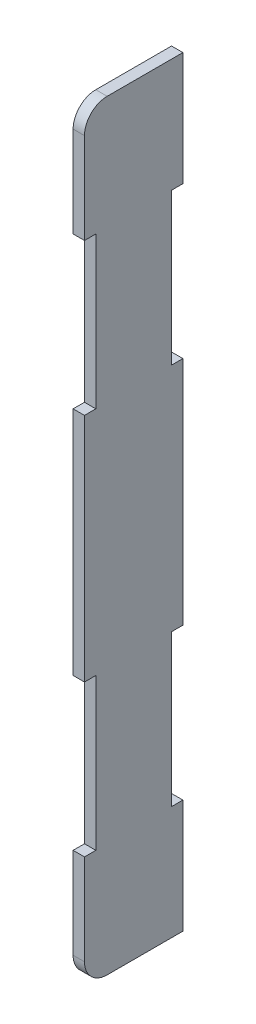
ISO-10303-21;
HEADER;
FILE_DESCRIPTION(('STEP AP214'),'2;1');
FILE_NAME('part.step','',(''),(''),'','','');
FILE_SCHEMA(('AUTOMOTIVE_DESIGN { 1 0 10303 214 1 1 1 1 }'));
ENDSEC;
DATA;
#1=APPLICATION_CONTEXT('core data for automotive mechanical design processes');
#2=APPLICATION_PROTOCOL_DEFINITION('international standard','automotive_design',2000,#1);
#3=PRODUCT_CONTEXT('',#1,'mechanical');
#4=PRODUCT('Part','Part','',(#3));
#5=PRODUCT_RELATED_PRODUCT_CATEGORY('part','',(#4));
#6=PRODUCT_DEFINITION_FORMATION('','',#4);
#7=PRODUCT_DEFINITION_CONTEXT('part definition',#1,'design');
#8=PRODUCT_DEFINITION('design','',#6,#7);
#9=PRODUCT_DEFINITION_SHAPE('','',#8);
#10=(LENGTH_UNIT() NAMED_UNIT(*) SI_UNIT(.MILLI.,.METRE.));
#11=(NAMED_UNIT(*) PLANE_ANGLE_UNIT() SI_UNIT($,.RADIAN.));
#12=(NAMED_UNIT(*) SI_UNIT($,.STERADIAN.) SOLID_ANGLE_UNIT());
#13=UNCERTAINTY_MEASURE_WITH_UNIT(LENGTH_MEASURE(1.E-05),#10,'distance_accuracy_value','');
#14=(GEOMETRIC_REPRESENTATION_CONTEXT(3) GLOBAL_UNCERTAINTY_ASSIGNED_CONTEXT((#13)) GLOBAL_UNIT_ASSIGNED_CONTEXT((#10,
#11,#12)) REPRESENTATION_CONTEXT('',''));
#15=CARTESIAN_POINT('',(0.,0.,0.));
#16=DIRECTION('',(0.,0.,1.));
#17=DIRECTION('',(1.,0.,0.));
#18=AXIS2_PLACEMENT_3D('',#15,#16,#17);
#19=CARTESIAN_POINT('',(3.,82.3989535577918,-5.56739419551117));
#20=DIRECTION('',(0.,0.,1.));
#21=DIRECTION('',(0.,-1.,0.));
#22=AXIS2_PLACEMENT_3D('',#19,#20,#21);
#23=PLANE('',#22);
#24=DIRECTION('',(-1.,0.,0.));
#25=VECTOR('',#24,1.);
#26=CARTESIAN_POINT('',(3.,12.3989535577918,-5.5673941955112));
#27=LINE('',#26,#25);
#28=CARTESIAN_POINT('',(3.,12.3989535577918,-5.5673941955112));
#29=VERTEX_POINT('',#28);
#30=CARTESIAN_POINT('',(0.,12.3989535577918,-5.5673941955112));
#31=VERTEX_POINT('',#30);
#32=EDGE_CURVE('E1307',#29,#31,#27,.T.);
#33=ORIENTED_EDGE('',*,*,#32,.F.);
#34=DIRECTION('',(0.,1.,0.));
#35=VECTOR('',#34,1.);
#36=CARTESIAN_POINT('',(3.,82.3989535577918,-5.56739419551117));
#37=LINE('',#36,#35);
#38=CARTESIAN_POINT('',(3.,-48.6010464422083,-5.5673941955112));
#39=VERTEX_POINT('',#38);
#40=EDGE_CURVE('E1347',#39,#29,#37,.T.);
#41=ORIENTED_EDGE('',*,*,#40,.F.);
#42=DIRECTION('',(-1.,0.,0.));
#43=VECTOR('',#42,1.);
#44=CARTESIAN_POINT('',(3.,-48.6010464422083,-5.5673941955112));
#45=LINE('',#44,#43);
#46=CARTESIAN_POINT('',(0.,-48.6010464422083,-5.5673941955112));
#47=VERTEX_POINT('',#46);
#48=EDGE_CURVE('E1328',#39,#47,#45,.T.);
#49=ORIENTED_EDGE('',*,*,#48,.T.);
#50=DIRECTION('',(0.,1.,0.));
#51=VECTOR('',#50,1.);
#52=CARTESIAN_POINT('',(0.,82.3989535577918,-5.56739419551117));
#53=LINE('',#52,#51);
#54=EDGE_CURVE('E1360',#47,#31,#53,.T.);
#55=ORIENTED_EDGE('',*,*,#54,.T.);
#56=EDGE_LOOP('',(#33,#41,#49,#55));
#57=FACE_BOUND('',#56,.T.);
#58=ADVANCED_FACE('F1068',(#57),#23,.F.);
#59=DIRECTION('',(-1.,0.,0.));
#60=VECTOR('',#59,1.);
#61=CARTESIAN_POINT('',(3.,52.3989535577918,-5.5673941955112));
#62=LINE('',#61,#60);
#63=CARTESIAN_POINT('',(3.,52.3989535577918,-5.5673941955112));
#64=VERTEX_POINT('',#63);
#65=CARTESIAN_POINT('',(0.,52.3989535577918,-5.5673941955112));
#66=VERTEX_POINT('',#65);
#67=EDGE_CURVE('E1304',#64,#66,#62,.T.);
#68=ORIENTED_EDGE('',*,*,#67,.T.);
#69=CARTESIAN_POINT('',(0.,82.3989535577918,-5.56739419551117));
#70=VERTEX_POINT('',#69);
#71=EDGE_CURVE('E1355',#66,#70,#53,.T.);
#72=ORIENTED_EDGE('',*,*,#71,.T.);
#73=DIRECTION('',(-1.,0.,0.));
#74=VECTOR('',#73,1.);
#75=CARTESIAN_POINT('',(3.,82.3989535577918,-5.56739419551117));
#76=LINE('',#75,#74);
#77=CARTESIAN_POINT('',(3.,82.3989535577918,-5.56739419551117));
#78=VERTEX_POINT('',#77);
#79=EDGE_CURVE('E1349',#78,#70,#76,.T.);
#80=ORIENTED_EDGE('',*,*,#79,.F.);
#81=EDGE_CURVE('E1342',#64,#78,#37,.T.);
#82=ORIENTED_EDGE('',*,*,#81,.F.);
#83=EDGE_LOOP('',(#68,#72,#80,#82));
#84=FACE_BOUND('',#83,.T.);
#85=ADVANCED_FACE('F1404',(#84),#23,.F.);
#86=CARTESIAN_POINT('',(3.,0.,0.));
#87=DIRECTION('',(1.,0.,0.));
#88=DIRECTION('',(0.,0.,-1.));
#89=AXIS2_PLACEMENT_3D('',#86,#87,#88);
#90=PLANE('',#89);
#91=DIRECTION('',(0.,0.,1.));
#92=VECTOR('',#91,1.);
#93=CARTESIAN_POINT('',(3.,82.3989535577918,20.4326058044888));
#94=LINE('',#93,#92);
#95=CARTESIAN_POINT('',(3.,82.3989535577918,14.4326058044888));
#96=VERTEX_POINT('',#95);
#97=EDGE_CURVE('E1346',#78,#96,#94,.T.);
#98=ORIENTED_EDGE('',*,*,#97,.T.);
#99=CARTESIAN_POINT('',(3.,76.3989535577917,14.4326058044888));
#100=DIRECTION('',(1.,0.,0.));
#101=DIRECTION('',(0.,0.,-1.));
#102=AXIS2_PLACEMENT_3D('',#99,#100,#101);
#103=CIRCLE('',#102,6.);
#104=CARTESIAN_POINT('',(3.,76.3989535577917,20.4326058044888));
#105=VERTEX_POINT('',#104);
#106=EDGE_CURVE('E12',#96,#105,#103,.T.);
#107=ORIENTED_EDGE('',*,*,#106,.T.);
#108=DIRECTION('',(0.,-1.,0.));
#109=VECTOR('',#108,1.);
#110=CARTESIAN_POINT('',(3.,82.3989535577918,20.4326058044888));
#111=LINE('',#110,#109);
#112=CARTESIAN_POINT('',(3.,52.3989535577918,20.4326058044888));
#113=VERTEX_POINT('',#112);
#114=EDGE_CURVE('E1337',#105,#113,#111,.T.);
#115=ORIENTED_EDGE('',*,*,#114,.T.);
#116=DIRECTION('',(0.,0.,1.));
#117=VECTOR('',#116,1.);
#118=CARTESIAN_POINT('',(3.,52.3989535577918,17.4326058044888));
#119=LINE('',#118,#117);
#120=CARTESIAN_POINT('',(3.,52.3989535577918,17.4326058044888));
#121=VERTEX_POINT('',#120);
#122=EDGE_CURVE('E1261',#121,#113,#119,.T.);
#123=ORIENTED_EDGE('',*,*,#122,.F.);
#124=DIRECTION('',(0.,1.,0.));
#125=VECTOR('',#124,1.);
#126=CARTESIAN_POINT('',(3.,52.3989535577918,17.4326058044888));
#127=LINE('',#126,#125);
#128=CARTESIAN_POINT('',(3.,12.3989535577918,17.4326058044888));
#129=VERTEX_POINT('',#128);
#130=EDGE_CURVE('E1259',#129,#121,#127,.T.);
#131=ORIENTED_EDGE('',*,*,#130,.F.);
#132=DIRECTION('',(0.,0.,-1.));
#133=VECTOR('',#132,1.);
#134=CARTESIAN_POINT('',(3.,12.3989535577918,17.4326058044888));
#135=LINE('',#134,#133);
#136=CARTESIAN_POINT('',(3.,12.3989535577918,20.4326058044888));
#137=VERTEX_POINT('',#136);
#138=EDGE_CURVE('E1265',#137,#129,#135,.T.);
#139=ORIENTED_EDGE('',*,*,#138,.F.);
#140=CARTESIAN_POINT('',(3.,-48.6010464422083,20.4326058044888));
#141=VERTEX_POINT('',#140);
#142=EDGE_CURVE('E1243',#137,#141,#111,.T.);
#143=ORIENTED_EDGE('',*,*,#142,.T.);
#144=DIRECTION('',(0.,0.,1.));
#145=VECTOR('',#144,1.);
#146=CARTESIAN_POINT('',(3.,-48.6010464422083,17.4326058044888));
#147=LINE('',#146,#145);
#148=CARTESIAN_POINT('',(3.,-48.6010464422083,17.4326058044888));
#149=VERTEX_POINT('',#148);
#150=EDGE_CURVE('E1228',#149,#141,#147,.T.);
#151=ORIENTED_EDGE('',*,*,#150,.F.);
#152=DIRECTION('',(0.,1.,0.));
#153=VECTOR('',#152,1.);
#154=CARTESIAN_POINT('',(3.,-88.6010464422083,17.4326058044888));
#155=LINE('',#154,#153);
#156=CARTESIAN_POINT('',(3.,-88.6010464422083,17.4326058044888));
#157=VERTEX_POINT('',#156);
#158=EDGE_CURVE('E1218',#157,#149,#155,.T.);
#159=ORIENTED_EDGE('',*,*,#158,.F.);
#160=DIRECTION('',(0.,0.,-1.));
#161=VECTOR('',#160,1.);
#162=CARTESIAN_POINT('',(3.,-88.6010464422083,17.4326058044888));
#163=LINE('',#162,#161);
#164=CARTESIAN_POINT('',(3.,-88.6010464422083,20.4326058044888));
#165=VERTEX_POINT('',#164);
#166=EDGE_CURVE('E1244',#165,#157,#163,.T.);
#167=ORIENTED_EDGE('',*,*,#166,.F.);
#168=CARTESIAN_POINT('',(3.,-112.601046442208,20.4326058044888));
#169=VERTEX_POINT('',#168);
#170=EDGE_CURVE('E1340',#165,#169,#111,.T.);
#171=ORIENTED_EDGE('',*,*,#170,.T.);
#172=CARTESIAN_POINT('',(3.,-112.601046442208,14.4326058044888));
#173=DIRECTION('',(1.,0.,0.));
#174=DIRECTION('',(0.,0.,-1.));
#175=AXIS2_PLACEMENT_3D('',#172,#173,#174);
#176=CIRCLE('',#175,6.);
#177=CARTESIAN_POINT('',(3.,-118.601046442208,14.4326058044888));
#178=VERTEX_POINT('',#177);
#179=EDGE_CURVE('E1374',#169,#178,#176,.T.);
#180=ORIENTED_EDGE('',*,*,#179,.T.);
#181=DIRECTION('',(0.,0.,-1.));
#182=VECTOR('',#181,1.);
#183=CARTESIAN_POINT('',(3.,-118.601046442208,20.4326058044888));
#184=LINE('',#183,#182);
#185=CARTESIAN_POINT('',(3.,-118.601046442208,-5.5673941955112));
#186=VERTEX_POINT('',#185);
#187=EDGE_CURVE('E1339',#178,#186,#184,.T.);
#188=ORIENTED_EDGE('',*,*,#187,.T.);
#189=CARTESIAN_POINT('',(3.,-88.6010464422083,-5.5673941955112));
#190=VERTEX_POINT('',#189);
#191=EDGE_CURVE('E1343',#186,#190,#37,.T.);
#192=ORIENTED_EDGE('',*,*,#191,.T.);
#193=DIRECTION('',(0.,0.,-1.));
#194=VECTOR('',#193,1.);
#195=CARTESIAN_POINT('',(3.,-88.6010464422083,-2.5673941955112));
#196=LINE('',#195,#194);
#197=CARTESIAN_POINT('',(3.,-88.6010464422083,-2.5673941955112));
#198=VERTEX_POINT('',#197);
#199=EDGE_CURVE('E1313',#198,#190,#196,.T.);
#200=ORIENTED_EDGE('',*,*,#199,.F.);
#201=DIRECTION('',(0.,-1.,0.));
#202=VECTOR('',#201,1.);
#203=CARTESIAN_POINT('',(3.,-88.6010464422083,-2.5673941955112));
#204=LINE('',#203,#202);
#205=CARTESIAN_POINT('',(3.,-48.6010464422083,-2.5673941955112));
#206=VERTEX_POINT('',#205);
#207=EDGE_CURVE('E1311',#206,#198,#204,.T.);
#208=ORIENTED_EDGE('',*,*,#207,.F.);
#209=DIRECTION('',(0.,0.,1.));
#210=VECTOR('',#209,1.);
#211=CARTESIAN_POINT('',(3.,-48.6010464422083,-2.5673941955112));
#212=LINE('',#211,#210);
#213=EDGE_CURVE('E1316',#39,#206,#212,.T.);
#214=ORIENTED_EDGE('',*,*,#213,.F.);
#215=ORIENTED_EDGE('',*,*,#40,.T.);
#216=DIRECTION('',(0.,0.,-1.));
#217=VECTOR('',#216,1.);
#218=CARTESIAN_POINT('',(3.,12.3989535577918,-2.5673941955112));
#219=LINE('',#218,#217);
#220=CARTESIAN_POINT('',(3.,12.3989535577918,-2.5673941955112));
#221=VERTEX_POINT('',#220);
#222=EDGE_CURVE('E1288',#221,#29,#219,.T.);
#223=ORIENTED_EDGE('',*,*,#222,.F.);
#224=DIRECTION('',(0.,-1.,0.));
#225=VECTOR('',#224,1.);
#226=CARTESIAN_POINT('',(3.,52.3989535577918,-2.5673941955112));
#227=LINE('',#226,#225);
#228=CARTESIAN_POINT('',(3.,52.3989535577918,-2.5673941955112));
#229=VERTEX_POINT('',#228);
#230=EDGE_CURVE('E1286',#229,#221,#227,.T.);
#231=ORIENTED_EDGE('',*,*,#230,.F.);
#232=DIRECTION('',(0.,0.,1.));
#233=VECTOR('',#232,1.);
#234=CARTESIAN_POINT('',(3.,52.3989535577918,-2.5673941955112));
#235=LINE('',#234,#233);
#236=EDGE_CURVE('E1291',#64,#229,#235,.T.);
#237=ORIENTED_EDGE('',*,*,#236,.F.);
#238=ORIENTED_EDGE('',*,*,#81,.T.);
#239=EDGE_LOOP('',(#98,#107,#115,#123,#131,#139,#143,#151,#159,#167,#171,#180,#188,#192,#200,
#208,#214,#215,#223,#231,#237,#238));
#240=FACE_BOUND('',#239,.T.);
#241=ADVANCED_FACE('F1240',(#240),#90,.T.);
#242=CARTESIAN_POINT('',(0.,0.,0.));
#243=DIRECTION('',(1.,0.,0.));
#244=DIRECTION('',(0.,0.,-1.));
#245=AXIS2_PLACEMENT_3D('',#242,#243,#244);
#246=PLANE('',#245);
#247=DIRECTION('',(0.,-1.,0.));
#248=VECTOR('',#247,1.);
#249=CARTESIAN_POINT('',(0.,82.3989535577918,20.4326058044888));
#250=LINE('',#249,#248);
#251=CARTESIAN_POINT('',(0.,76.3989535577917,20.4326058044888));
#252=VERTEX_POINT('',#251);
#253=CARTESIAN_POINT('',(0.,52.3989535577918,20.4326058044888));
#254=VERTEX_POINT('',#253);
#255=EDGE_CURVE('E1350',#252,#254,#250,.T.);
#256=ORIENTED_EDGE('',*,*,#255,.F.);
#257=CARTESIAN_POINT('',(0.,76.3989535577917,14.4326058044888));
#258=DIRECTION('',(1.,0.,0.));
#259=DIRECTION('',(0.,0.,-1.));
#260=AXIS2_PLACEMENT_3D('',#257,#258,#259);
#261=CIRCLE('',#260,6.);
#262=CARTESIAN_POINT('',(0.,82.3989535577918,14.4326058044888));
#263=VERTEX_POINT('',#262);
#264=EDGE_CURVE('E1090',#252,#263,#261,.F.);
#265=ORIENTED_EDGE('',*,*,#264,.T.);
#266=DIRECTION('',(0.,0.,1.));
#267=VECTOR('',#266,1.);
#268=CARTESIAN_POINT('',(0.,82.3989535577918,20.4326058044888));
#269=LINE('',#268,#267);
#270=EDGE_CURVE('E1359',#70,#263,#269,.T.);
#271=ORIENTED_EDGE('',*,*,#270,.F.);
#272=ORIENTED_EDGE('',*,*,#71,.F.);
#273=DIRECTION('',(0.,0.,1.));
#274=VECTOR('',#273,1.);
#275=CARTESIAN_POINT('',(0.,52.3989535577918,-2.5673941955112));
#276=LINE('',#275,#274);
#277=CARTESIAN_POINT('',(0.,52.3989535577918,-2.5673941955112));
#278=VERTEX_POINT('',#277);
#279=EDGE_CURVE('E1289',#66,#278,#276,.T.);
#280=ORIENTED_EDGE('',*,*,#279,.T.);
#281=DIRECTION('',(0.,-1.,0.));
#282=VECTOR('',#281,1.);
#283=CARTESIAN_POINT('',(0.,52.3989535577918,-2.5673941955112));
#284=LINE('',#283,#282);
#285=CARTESIAN_POINT('',(0.,12.3989535577918,-2.5673941955112));
#286=VERTEX_POINT('',#285);
#287=EDGE_CURVE('E1294',#278,#286,#284,.T.);
#288=ORIENTED_EDGE('',*,*,#287,.T.);
#289=DIRECTION('',(0.,0.,-1.));
#290=VECTOR('',#289,1.);
#291=CARTESIAN_POINT('',(0.,12.3989535577918,-2.5673941955112));
#292=LINE('',#291,#290);
#293=EDGE_CURVE('E1297',#286,#31,#292,.T.);
#294=ORIENTED_EDGE('',*,*,#293,.T.);
#295=ORIENTED_EDGE('',*,*,#54,.F.);
#296=DIRECTION('',(0.,0.,1.));
#297=VECTOR('',#296,1.);
#298=CARTESIAN_POINT('',(0.,-48.6010464422083,-2.5673941955112));
#299=LINE('',#298,#297);
#300=CARTESIAN_POINT('',(0.,-48.6010464422083,-2.5673941955112));
#301=VERTEX_POINT('',#300);
#302=EDGE_CURVE('E1314',#47,#301,#299,.T.);
#303=ORIENTED_EDGE('',*,*,#302,.T.);
#304=DIRECTION('',(0.,-1.,0.));
#305=VECTOR('',#304,1.);
#306=CARTESIAN_POINT('',(0.,-88.6010464422083,-2.5673941955112));
#307=LINE('',#306,#305);
#308=CARTESIAN_POINT('',(0.,-88.6010464422083,-2.5673941955112));
#309=VERTEX_POINT('',#308);
#310=EDGE_CURVE('E1236',#301,#309,#307,.T.);
#311=ORIENTED_EDGE('',*,*,#310,.T.);
#312=DIRECTION('',(0.,0.,-1.));
#313=VECTOR('',#312,1.);
#314=CARTESIAN_POINT('',(0.,-88.6010464422083,-2.5673941955112));
#315=LINE('',#314,#313);
#316=CARTESIAN_POINT('',(0.,-88.6010464422083,-5.5673941955112));
#317=VERTEX_POINT('',#316);
#318=EDGE_CURVE('E1321',#309,#317,#315,.T.);
#319=ORIENTED_EDGE('',*,*,#318,.T.);
#320=CARTESIAN_POINT('',(0.,-118.601046442208,-5.5673941955112));
#321=VERTEX_POINT('',#320);
#322=EDGE_CURVE('E1356',#321,#317,#53,.T.);
#323=ORIENTED_EDGE('',*,*,#322,.F.);
#324=DIRECTION('',(0.,0.,-1.));
#325=VECTOR('',#324,1.);
#326=CARTESIAN_POINT('',(0.,-118.601046442208,20.4326058044888));
#327=LINE('',#326,#325);
#328=CARTESIAN_POINT('',(0.,-118.601046442208,14.4326058044888));
#329=VERTEX_POINT('',#328);
#330=EDGE_CURVE('E1352',#329,#321,#327,.T.);
#331=ORIENTED_EDGE('',*,*,#330,.F.);
#332=CARTESIAN_POINT('',(0.,-112.601046442208,14.4326058044888));
#333=DIRECTION('',(1.,0.,0.));
#334=DIRECTION('',(0.,0.,-1.));
#335=AXIS2_PLACEMENT_3D('',#332,#333,#334);
#336=CIRCLE('',#335,6.);
#337=CARTESIAN_POINT('',(0.,-112.601046442208,20.4326058044888));
#338=VERTEX_POINT('',#337);
#339=EDGE_CURVE('E1370',#329,#338,#336,.F.);
#340=ORIENTED_EDGE('',*,*,#339,.T.);
#341=CARTESIAN_POINT('',(0.,-88.6010464422083,20.4326058044888));
#342=VERTEX_POINT('',#341);
#343=EDGE_CURVE('E1336',#342,#338,#250,.T.);
#344=ORIENTED_EDGE('',*,*,#343,.F.);
#345=DIRECTION('',(0.,0.,-1.));
#346=VECTOR('',#345,1.);
#347=CARTESIAN_POINT('',(0.,-88.6010464422083,17.4326058044888));
#348=LINE('',#347,#346);
#349=CARTESIAN_POINT('',(0.,-88.6010464422083,17.4326058044888));
#350=VERTEX_POINT('',#349);
#351=EDGE_CURVE('E1229',#342,#350,#348,.T.);
#352=ORIENTED_EDGE('',*,*,#351,.T.);
#353=DIRECTION('',(0.,1.,0.));
#354=VECTOR('',#353,1.);
#355=CARTESIAN_POINT('',(0.,-88.6010464422083,17.4326058044888));
#356=LINE('',#355,#354);
#357=CARTESIAN_POINT('',(0.,-48.6010464422083,17.4326058044888));
#358=VERTEX_POINT('',#357);
#359=EDGE_CURVE('E1248',#350,#358,#356,.T.);
#360=ORIENTED_EDGE('',*,*,#359,.T.);
#361=DIRECTION('',(0.,0.,1.));
#362=VECTOR('',#361,1.);
#363=CARTESIAN_POINT('',(0.,-48.6010464422083,17.4326058044888));
#364=LINE('',#363,#362);
#365=CARTESIAN_POINT('',(0.,-48.6010464422083,20.4326058044888));
#366=VERTEX_POINT('',#365);
#367=EDGE_CURVE('E1235',#358,#366,#364,.T.);
#368=ORIENTED_EDGE('',*,*,#367,.T.);
#369=CARTESIAN_POINT('',(0.,12.3989535577918,20.4326058044888));
#370=VERTEX_POINT('',#369);
#371=EDGE_CURVE('E1353',#370,#366,#250,.T.);
#372=ORIENTED_EDGE('',*,*,#371,.F.);
#373=DIRECTION('',(0.,0.,-1.));
#374=VECTOR('',#373,1.);
#375=CARTESIAN_POINT('',(0.,12.3989535577918,17.4326058044888));
#376=LINE('',#375,#374);
#377=CARTESIAN_POINT('',(0.,12.3989535577918,17.4326058044888));
#378=VERTEX_POINT('',#377);
#379=EDGE_CURVE('E1262',#370,#378,#376,.T.);
#380=ORIENTED_EDGE('',*,*,#379,.T.);
#381=DIRECTION('',(0.,1.,0.));
#382=VECTOR('',#381,1.);
#383=CARTESIAN_POINT('',(0.,52.3989535577918,17.4326058044888));
#384=LINE('',#383,#382);
#385=CARTESIAN_POINT('',(0.,52.3989535577918,17.4326058044888));
#386=VERTEX_POINT('',#385);
#387=EDGE_CURVE('E1268',#378,#386,#384,.T.);
#388=ORIENTED_EDGE('',*,*,#387,.T.);
#389=DIRECTION('',(0.,0.,1.));
#390=VECTOR('',#389,1.);
#391=CARTESIAN_POINT('',(0.,52.3989535577918,17.4326058044888));
#392=LINE('',#391,#390);
#393=EDGE_CURVE('E1271',#386,#254,#392,.T.);
#394=ORIENTED_EDGE('',*,*,#393,.T.);
#395=EDGE_LOOP('',(#256,#265,#271,#272,#280,#288,#294,#295,#303,#311,#319,#323,#331,#340,#344,
#352,#360,#368,#372,#380,#388,#394));
#396=FACE_BOUND('',#395,.T.);
#397=ADVANCED_FACE('F1386',(#396),#246,.F.);
#398=CARTESIAN_POINT('',(3.,82.3989535577918,20.4326058044888));
#399=DIRECTION('',(0.,0.,-1.));
#400=DIRECTION('',(0.,1.,0.));
#401=AXIS2_PLACEMENT_3D('',#398,#399,#400);
#402=PLANE('',#401);
#403=DIRECTION('',(-1.,0.,0.));
#404=VECTOR('',#403,1.);
#405=CARTESIAN_POINT('',(3.,-48.6010464422083,20.4326058044888));
#406=LINE('',#405,#404);
#407=EDGE_CURVE('E1237',#141,#366,#406,.T.);
#408=ORIENTED_EDGE('',*,*,#407,.F.);
#409=ORIENTED_EDGE('',*,*,#142,.F.);
#410=DIRECTION('',(-1.,0.,0.));
#411=VECTOR('',#410,1.);
#412=CARTESIAN_POINT('',(3.,12.3989535577918,20.4326058044888));
#413=LINE('',#412,#411);
#414=EDGE_CURVE('E1278',#137,#370,#413,.T.);
#415=ORIENTED_EDGE('',*,*,#414,.T.);
#416=ORIENTED_EDGE('',*,*,#371,.T.);
#417=EDGE_LOOP('',(#408,#409,#415,#416));
#418=FACE_BOUND('',#417,.T.);
#419=ADVANCED_FACE('F1426',(#418),#402,.F.);
#420=ORIENTED_EDGE('',*,*,#343,.T.);
#421=DIRECTION('',(-1.,0.,0.));
#422=VECTOR('',#421,1.);
#423=CARTESIAN_POINT('',(3.,-112.601046442208,20.4326058044888));
#424=LINE('',#423,#422);
#425=EDGE_CURVE('E1372',#338,#169,#424,.F.);
#426=ORIENTED_EDGE('',*,*,#425,.T.);
#427=ORIENTED_EDGE('',*,*,#170,.F.);
#428=DIRECTION('',(-1.,0.,0.));
#429=VECTOR('',#428,1.);
#430=CARTESIAN_POINT('',(3.,-88.6010464422083,20.4326058044888));
#431=LINE('',#430,#429);
#432=EDGE_CURVE('E1255',#165,#342,#431,.T.);
#433=ORIENTED_EDGE('',*,*,#432,.T.);
#434=EDGE_LOOP('',(#420,#426,#427,#433));
#435=FACE_BOUND('',#434,.T.);
#436=ADVANCED_FACE('F1424',(#435),#402,.F.);
#437=ORIENTED_EDGE('',*,*,#114,.F.);
#438=DIRECTION('',(-1.,0.,0.));
#439=VECTOR('',#438,1.);
#440=CARTESIAN_POINT('',(3.,76.3989535577917,20.4326058044888));
#441=LINE('',#440,#439);
#442=EDGE_CURVE('E1376',#105,#252,#441,.T.);
#443=ORIENTED_EDGE('',*,*,#442,.T.);
#444=ORIENTED_EDGE('',*,*,#255,.T.);
#445=DIRECTION('',(-1.,0.,0.));
#446=VECTOR('',#445,1.);
#447=CARTESIAN_POINT('',(3.,52.3989535577918,20.4326058044888));
#448=LINE('',#447,#446);
#449=EDGE_CURVE('E1281',#113,#254,#448,.T.);
#450=ORIENTED_EDGE('',*,*,#449,.F.);
#451=EDGE_LOOP('',(#437,#443,#444,#450));
#452=FACE_BOUND('',#451,.T.);
#453=ADVANCED_FACE('F1382',(#452),#402,.F.);
#454=DIRECTION('',(-1.,0.,0.));
#455=VECTOR('',#454,1.);
#456=CARTESIAN_POINT('',(3.,-88.6010464422083,-5.5673941955112));
#457=LINE('',#456,#455);
#458=EDGE_CURVE('E1331',#190,#317,#457,.T.);
#459=ORIENTED_EDGE('',*,*,#458,.F.);
#460=ORIENTED_EDGE('',*,*,#191,.F.);
#461=DIRECTION('',(-1.,0.,0.));
#462=VECTOR('',#461,1.);
#463=CARTESIAN_POINT('',(3.,-118.601046442208,-5.5673941955112));
#464=LINE('',#463,#462);
#465=EDGE_CURVE('E1364',#186,#321,#464,.T.);
#466=ORIENTED_EDGE('',*,*,#465,.T.);
#467=ORIENTED_EDGE('',*,*,#322,.T.);
#468=EDGE_LOOP('',(#459,#460,#466,#467));
#469=FACE_BOUND('',#468,.T.);
#470=ADVANCED_FACE('F1407',(#469),#23,.F.);
#471=CARTESIAN_POINT('',(3.,-118.601046442208,20.4326058044888));
#472=DIRECTION('',(0.,1.,0.));
#473=DIRECTION('',(0.,0.,1.));
#474=AXIS2_PLACEMENT_3D('',#471,#472,#473);
#475=PLANE('',#474);
#476=ORIENTED_EDGE('',*,*,#187,.F.);
#477=DIRECTION('',(-1.,0.,0.));
#478=VECTOR('',#477,1.);
#479=CARTESIAN_POINT('',(3.,-118.601046442208,14.4326058044888));
#480=LINE('',#479,#478);
#481=EDGE_CURVE('E1367',#178,#329,#480,.T.);
#482=ORIENTED_EDGE('',*,*,#481,.T.);
#483=ORIENTED_EDGE('',*,*,#330,.T.);
#484=ORIENTED_EDGE('',*,*,#465,.F.);
#485=EDGE_LOOP('',(#476,#482,#483,#484));
#486=FACE_BOUND('',#485,.T.);
#487=ADVANCED_FACE('F1416',(#486),#475,.F.);
#488=CARTESIAN_POINT('',(3.,82.3989535577918,20.4326058044888));
#489=DIRECTION('',(0.,-1.,0.));
#490=DIRECTION('',(0.,0.,-1.));
#491=AXIS2_PLACEMENT_3D('',#488,#489,#490);
#492=PLANE('',#491);
#493=ORIENTED_EDGE('',*,*,#270,.T.);
#494=DIRECTION('',(-1.,0.,0.));
#495=VECTOR('',#494,1.);
#496=CARTESIAN_POINT('',(3.,82.3989535577918,14.4326058044888));
#497=LINE('',#496,#495);
#498=EDGE_CURVE('E1076',#263,#96,#497,.F.);
#499=ORIENTED_EDGE('',*,*,#498,.T.);
#500=ORIENTED_EDGE('',*,*,#97,.F.);
#501=ORIENTED_EDGE('',*,*,#79,.T.);
#502=EDGE_LOOP('',(#493,#499,#500,#501));
#503=FACE_BOUND('',#502,.T.);
#504=ADVANCED_FACE('F1422',(#503),#492,.F.);
#505=CARTESIAN_POINT('',(3.,-88.6010464422083,-2.5673941955112));
#506=DIRECTION('',(0.,0.,-1.));
#507=DIRECTION('',(-1.,0.,0.));
#508=AXIS2_PLACEMENT_3D('',#505,#506,#507);
#509=PLANE('',#508);
#510=ORIENTED_EDGE('',*,*,#310,.F.);
#511=DIRECTION('',(-1.,0.,0.));
#512=VECTOR('',#511,1.);
#513=CARTESIAN_POINT('',(3.,-48.6010464422083,-2.5673941955112));
#514=LINE('',#513,#512);
#515=EDGE_CURVE('E1318',#206,#301,#514,.T.);
#516=ORIENTED_EDGE('',*,*,#515,.F.);
#517=ORIENTED_EDGE('',*,*,#207,.T.);
#518=DIRECTION('',(-1.,0.,0.));
#519=VECTOR('',#518,1.);
#520=CARTESIAN_POINT('',(3.,-88.6010464422083,-2.5673941955112));
#521=LINE('',#520,#519);
#522=EDGE_CURVE('E1333',#198,#309,#521,.T.);
#523=ORIENTED_EDGE('',*,*,#522,.T.);
#524=EDGE_LOOP('',(#510,#516,#517,#523));
#525=FACE_BOUND('',#524,.T.);
#526=ADVANCED_FACE('F1442',(#525),#509,.T.);
#527=CARTESIAN_POINT('',(3.,-88.6010464422083,-2.5673941955112));
#528=DIRECTION('',(0.,1.,0.));
#529=DIRECTION('',(0.,0.,1.));
#530=AXIS2_PLACEMENT_3D('',#527,#528,#529);
#531=PLANE('',#530);
#532=ORIENTED_EDGE('',*,*,#318,.F.);
#533=ORIENTED_EDGE('',*,*,#522,.F.);
#534=ORIENTED_EDGE('',*,*,#199,.T.);
#535=ORIENTED_EDGE('',*,*,#458,.T.);
#536=EDGE_LOOP('',(#532,#533,#534,#535));
#537=FACE_BOUND('',#536,.T.);
#538=ADVANCED_FACE('F1440',(#537),#531,.T.);
#539=CARTESIAN_POINT('',(3.,-48.6010464422083,-2.5673941955112));
#540=DIRECTION('',(0.,-1.,0.));
#541=DIRECTION('',(0.,0.,-1.));
#542=AXIS2_PLACEMENT_3D('',#539,#540,#541);
#543=PLANE('',#542);
#544=ORIENTED_EDGE('',*,*,#302,.F.);
#545=ORIENTED_EDGE('',*,*,#48,.F.);
#546=ORIENTED_EDGE('',*,*,#213,.T.);
#547=ORIENTED_EDGE('',*,*,#515,.T.);
#548=EDGE_LOOP('',(#544,#545,#546,#547));
#549=FACE_BOUND('',#548,.T.);
#550=ADVANCED_FACE('F1468',(#549),#543,.T.);
#551=CARTESIAN_POINT('',(3.,52.3989535577918,17.4326058044888));
#552=DIRECTION('',(0.,0.,1.));
#553=DIRECTION('',(0.,-1.,0.));
#554=AXIS2_PLACEMENT_3D('',#551,#552,#553);
#555=PLANE('',#554);
#556=ORIENTED_EDGE('',*,*,#387,.F.);
#557=DIRECTION('',(-1.,0.,0.));
#558=VECTOR('',#557,1.);
#559=CARTESIAN_POINT('',(3.,12.3989535577918,17.4326058044888));
#560=LINE('',#559,#558);
#561=EDGE_CURVE('E1267',#129,#378,#560,.T.);
#562=ORIENTED_EDGE('',*,*,#561,.F.);
#563=ORIENTED_EDGE('',*,*,#130,.T.);
#564=DIRECTION('',(-1.,0.,0.));
#565=VECTOR('',#564,1.);
#566=CARTESIAN_POINT('',(3.,52.3989535577918,17.4326058044888));
#567=LINE('',#566,#565);
#568=EDGE_CURVE('E1250',#121,#386,#567,.T.);
#569=ORIENTED_EDGE('',*,*,#568,.T.);
#570=EDGE_LOOP('',(#556,#562,#563,#569));
#571=FACE_BOUND('',#570,.T.);
#572=ADVANCED_FACE('F1393',(#571),#555,.T.);
#573=CARTESIAN_POINT('',(3.,52.3989535577918,17.4326058044888));
#574=DIRECTION('',(0.,-1.,0.));
#575=DIRECTION('',(0.,0.,-1.));
#576=AXIS2_PLACEMENT_3D('',#573,#574,#575);
#577=PLANE('',#576);
#578=ORIENTED_EDGE('',*,*,#393,.F.);
#579=ORIENTED_EDGE('',*,*,#568,.F.);
#580=ORIENTED_EDGE('',*,*,#122,.T.);
#581=ORIENTED_EDGE('',*,*,#449,.T.);
#582=EDGE_LOOP('',(#578,#579,#580,#581));
#583=FACE_BOUND('',#582,.T.);
#584=ADVANCED_FACE('F1390',(#583),#577,.T.);
#585=CARTESIAN_POINT('',(3.,12.3989535577918,17.4326058044888));
#586=DIRECTION('',(0.,1.,0.));
#587=DIRECTION('',(0.,0.,1.));
#588=AXIS2_PLACEMENT_3D('',#585,#586,#587);
#589=PLANE('',#588);
#590=ORIENTED_EDGE('',*,*,#379,.F.);
#591=ORIENTED_EDGE('',*,*,#414,.F.);
#592=ORIENTED_EDGE('',*,*,#138,.T.);
#593=ORIENTED_EDGE('',*,*,#561,.T.);
#594=EDGE_LOOP('',(#590,#591,#592,#593));
#595=FACE_BOUND('',#594,.T.);
#596=ADVANCED_FACE('F1487',(#595),#589,.T.);
#597=CARTESIAN_POINT('',(3.,-88.6010464422083,17.4326058044888));
#598=DIRECTION('',(0.,0.,1.));
#599=DIRECTION('',(0.,-1.,0.));
#600=AXIS2_PLACEMENT_3D('',#597,#598,#599);
#601=PLANE('',#600);
#602=ORIENTED_EDGE('',*,*,#359,.F.);
#603=DIRECTION('',(-1.,0.,0.));
#604=VECTOR('',#603,1.);
#605=CARTESIAN_POINT('',(3.,-88.6010464422083,17.4326058044888));
#606=LINE('',#605,#604);
#607=EDGE_CURVE('E1224',#157,#350,#606,.T.);
#608=ORIENTED_EDGE('',*,*,#607,.F.);
#609=ORIENTED_EDGE('',*,*,#158,.T.);
#610=DIRECTION('',(-1.,0.,0.));
#611=VECTOR('',#610,1.);
#612=CARTESIAN_POINT('',(3.,-48.6010464422083,17.4326058044888));
#613=LINE('',#612,#611);
#614=EDGE_CURVE('E1222',#149,#358,#613,.T.);
#615=ORIENTED_EDGE('',*,*,#614,.T.);
#616=EDGE_LOOP('',(#602,#608,#609,#615));
#617=FACE_BOUND('',#616,.T.);
#618=ADVANCED_FACE('F1221',(#617),#601,.T.);
#619=CARTESIAN_POINT('',(3.,-48.6010464422083,17.4326058044888));
#620=DIRECTION('',(0.,-1.,0.));
#621=DIRECTION('',(0.,0.,-1.));
#622=AXIS2_PLACEMENT_3D('',#619,#620,#621);
#623=PLANE('',#622);
#624=ORIENTED_EDGE('',*,*,#367,.F.);
#625=ORIENTED_EDGE('',*,*,#614,.F.);
#626=ORIENTED_EDGE('',*,*,#150,.T.);
#627=ORIENTED_EDGE('',*,*,#407,.T.);
#628=EDGE_LOOP('',(#624,#625,#626,#627));
#629=FACE_BOUND('',#628,.T.);
#630=ADVANCED_FACE('F1232',(#629),#623,.T.);
#631=CARTESIAN_POINT('',(3.,-88.6010464422083,17.4326058044888));
#632=DIRECTION('',(0.,1.,0.));
#633=DIRECTION('',(0.,0.,1.));
#634=AXIS2_PLACEMENT_3D('',#631,#632,#633);
#635=PLANE('',#634);
#636=ORIENTED_EDGE('',*,*,#351,.F.);
#637=ORIENTED_EDGE('',*,*,#432,.F.);
#638=ORIENTED_EDGE('',*,*,#166,.T.);
#639=ORIENTED_EDGE('',*,*,#607,.T.);
#640=EDGE_LOOP('',(#636,#637,#638,#639));
#641=FACE_BOUND('',#640,.T.);
#642=ADVANCED_FACE('F1475',(#641),#635,.T.);
#643=CARTESIAN_POINT('',(3.,52.3989535577918,-2.5673941955112));
#644=DIRECTION('',(0.,0.,-1.));
#645=DIRECTION('',(-1.,0.,0.));
#646=AXIS2_PLACEMENT_3D('',#643,#644,#645);
#647=PLANE('',#646);
#648=ORIENTED_EDGE('',*,*,#287,.F.);
#649=DIRECTION('',(-1.,0.,0.));
#650=VECTOR('',#649,1.);
#651=CARTESIAN_POINT('',(3.,52.3989535577918,-2.5673941955112));
#652=LINE('',#651,#650);
#653=EDGE_CURVE('E1293',#229,#278,#652,.T.);
#654=ORIENTED_EDGE('',*,*,#653,.F.);
#655=ORIENTED_EDGE('',*,*,#230,.T.);
#656=DIRECTION('',(-1.,0.,0.));
#657=VECTOR('',#656,1.);
#658=CARTESIAN_POINT('',(3.,12.3989535577918,-2.5673941955112));
#659=LINE('',#658,#657);
#660=EDGE_CURVE('E1272',#221,#286,#659,.T.);
#661=ORIENTED_EDGE('',*,*,#660,.T.);
#662=EDGE_LOOP('',(#648,#654,#655,#661));
#663=FACE_BOUND('',#662,.T.);
#664=ADVANCED_FACE('F1471',(#663),#647,.T.);
#665=CARTESIAN_POINT('',(3.,12.3989535577918,-2.5673941955112));
#666=DIRECTION('',(0.,1.,0.));
#667=DIRECTION('',(0.,0.,1.));
#668=AXIS2_PLACEMENT_3D('',#665,#666,#667);
#669=PLANE('',#668);
#670=ORIENTED_EDGE('',*,*,#293,.F.);
#671=ORIENTED_EDGE('',*,*,#660,.F.);
#672=ORIENTED_EDGE('',*,*,#222,.T.);
#673=ORIENTED_EDGE('',*,*,#32,.T.);
#674=EDGE_LOOP('',(#670,#671,#672,#673));
#675=FACE_BOUND('',#674,.T.);
#676=ADVANCED_FACE('F1474',(#675),#669,.T.);
#677=CARTESIAN_POINT('',(3.,52.3989535577918,-2.5673941955112));
#678=DIRECTION('',(0.,-1.,0.));
#679=DIRECTION('',(0.,0.,-1.));
#680=AXIS2_PLACEMENT_3D('',#677,#678,#679);
#681=PLANE('',#680);
#682=ORIENTED_EDGE('',*,*,#279,.F.);
#683=ORIENTED_EDGE('',*,*,#67,.F.);
#684=ORIENTED_EDGE('',*,*,#236,.T.);
#685=ORIENTED_EDGE('',*,*,#653,.T.);
#686=EDGE_LOOP('',(#682,#683,#684,#685));
#687=FACE_BOUND('',#686,.T.);
#688=ADVANCED_FACE('F1401',(#687),#681,.T.);
#689=CARTESIAN_POINT('',(3.,-112.601046442208,14.4326058044888));
#690=DIRECTION('',(-1.,0.,0.));
#691=DIRECTION('',(0.,0.,1.));
#692=AXIS2_PLACEMENT_3D('',#689,#690,#691);
#693=CYLINDRICAL_SURFACE('',#692,6.);
#694=ORIENTED_EDGE('',*,*,#179,.F.);
#695=ORIENTED_EDGE('',*,*,#425,.F.);
#696=ORIENTED_EDGE('',*,*,#339,.F.);
#697=ORIENTED_EDGE('',*,*,#481,.F.);
#698=EDGE_LOOP('',(#694,#695,#696,#697));
#699=FACE_BOUND('',#698,.T.);
#700=ADVANCED_FACE('F1397',(#699),#693,.T.);
#701=CARTESIAN_POINT('',(3.,76.3989535577917,14.4326058044888));
#702=DIRECTION('',(-1.,0.,0.));
#703=DIRECTION('',(0.,0.,1.));
#704=AXIS2_PLACEMENT_3D('',#701,#702,#703);
#705=CYLINDRICAL_SURFACE('',#704,6.);
#706=ORIENTED_EDGE('',*,*,#106,.F.);
#707=ORIENTED_EDGE('',*,*,#498,.F.);
#708=ORIENTED_EDGE('',*,*,#264,.F.);
#709=ORIENTED_EDGE('',*,*,#442,.F.);
#710=EDGE_LOOP('',(#706,#707,#708,#709));
#711=FACE_BOUND('',#710,.T.);
#712=ADVANCED_FACE('F1070',(#711),#705,.T.);
#713=CLOSED_SHELL('',(#58,#85,#241,#397,#419,#436,#453,#470,#487,#504,#526,#538,#550,#572,#584,
#596,#618,#630,#642,#664,#676,#688,#700,#712));
#714=MANIFOLD_SOLID_BREP('B2',#713);
#715=ADVANCED_BREP_SHAPE_REPRESENTATION('',(#18,#714),#14);
#716=SHAPE_DEFINITION_REPRESENTATION(#9,#715);
ENDSEC;
END-ISO-10303-21;
